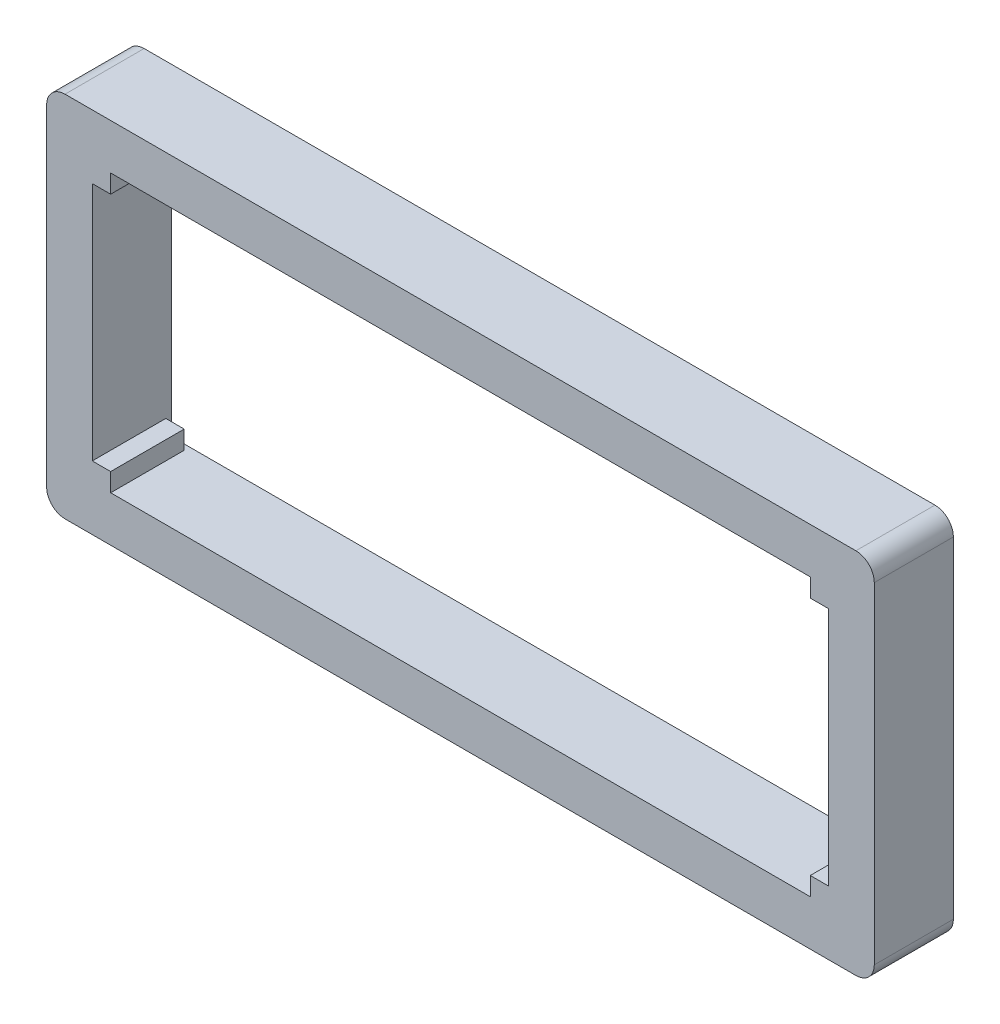
ISO-10303-21;
HEADER;
FILE_DESCRIPTION(('STEP AP214'),'2;1');
FILE_NAME('part.step','',(''),(''),'','','');
FILE_SCHEMA(('AUTOMOTIVE_DESIGN { 1 0 10303 214 1 1 1 1 }'));
ENDSEC;
DATA;
#1=APPLICATION_CONTEXT('core data for automotive mechanical design processes');
#2=APPLICATION_PROTOCOL_DEFINITION('international standard','automotive_design',2000,#1);
#3=PRODUCT_CONTEXT('',#1,'mechanical');
#4=PRODUCT('Part','Part','',(#3));
#5=PRODUCT_RELATED_PRODUCT_CATEGORY('part','',(#4));
#6=PRODUCT_DEFINITION_FORMATION('','',#4);
#7=PRODUCT_DEFINITION_CONTEXT('part definition',#1,'design');
#8=PRODUCT_DEFINITION('design','',#6,#7);
#9=PRODUCT_DEFINITION_SHAPE('','',#8);
#10=(LENGTH_UNIT() NAMED_UNIT(*) SI_UNIT(.MILLI.,.METRE.));
#11=(NAMED_UNIT(*) PLANE_ANGLE_UNIT() SI_UNIT($,.RADIAN.));
#12=(NAMED_UNIT(*) SI_UNIT($,.STERADIAN.) SOLID_ANGLE_UNIT());
#13=UNCERTAINTY_MEASURE_WITH_UNIT(LENGTH_MEASURE(1.E-05),#10,'distance_accuracy_value','');
#14=(GEOMETRIC_REPRESENTATION_CONTEXT(3) GLOBAL_UNCERTAINTY_ASSIGNED_CONTEXT((#13)) GLOBAL_UNIT_ASSIGNED_CONTEXT((#10,
#11,#12)) REPRESENTATION_CONTEXT('',''));
#15=CARTESIAN_POINT('',(0.,0.,0.));
#16=DIRECTION('',(0.,0.,1.));
#17=DIRECTION('',(1.,0.,0.));
#18=AXIS2_PLACEMENT_3D('',#15,#16,#17);
#19=CARTESIAN_POINT('',(0.,0.,0.));
#20=DIRECTION('',(0.,0.,1.));
#21=DIRECTION('',(1.,0.,0.));
#22=AXIS2_PLACEMENT_3D('',#19,#20,#21);
#23=PLANE('',#22);
#24=DIRECTION('',(1.,0.,0.));
#25=VECTOR('',#24,1.);
#26=CARTESIAN_POINT('',(-12.4,-12.35,0.));
#27=LINE('',#26,#25);
#28=CARTESIAN_POINT('',(-7.40000000000004,-12.35,0.));
#29=VERTEX_POINT('',#28);
#30=CARTESIAN_POINT('',(207.6,-12.35,0.));
#31=VERTEX_POINT('',#30);
#32=EDGE_CURVE('E360',#29,#31,#27,.T.);
#33=ORIENTED_EDGE('',*,*,#32,.F.);
#34=CARTESIAN_POINT('',(-7.40000000000004,-7.35000000000001,0.));
#35=DIRECTION('',(0.,0.,1.));
#36=DIRECTION('',(1.,0.,0.));
#37=AXIS2_PLACEMENT_3D('',#34,#35,#36);
#38=CIRCLE('',#37,5.);
#39=CARTESIAN_POINT('',(-12.4,-7.35000000000001,0.));
#40=VERTEX_POINT('',#39);
#41=EDGE_CURVE('E376',#29,#40,#38,.F.);
#42=ORIENTED_EDGE('',*,*,#41,.T.);
#43=DIRECTION('',(0.,-1.,0.));
#44=VECTOR('',#43,1.);
#45=CARTESIAN_POINT('',(-12.4,87.65,0.));
#46=LINE('',#45,#44);
#47=CARTESIAN_POINT('',(-12.4,82.65,0.));
#48=VERTEX_POINT('',#47);
#49=EDGE_CURVE('E353',#48,#40,#46,.T.);
#50=ORIENTED_EDGE('',*,*,#49,.F.);
#51=CARTESIAN_POINT('',(-7.40000000000004,82.65,0.));
#52=DIRECTION('',(0.,0.,1.));
#53=DIRECTION('',(1.,0.,0.));
#54=AXIS2_PLACEMENT_3D('',#51,#52,#53);
#55=CIRCLE('',#54,5.);
#56=CARTESIAN_POINT('',(-7.40000000000004,87.65,0.));
#57=VERTEX_POINT('',#56);
#58=EDGE_CURVE('E367',#48,#57,#55,.F.);
#59=ORIENTED_EDGE('',*,*,#58,.T.);
#60=DIRECTION('',(-1.,0.,0.));
#61=VECTOR('',#60,1.);
#62=CARTESIAN_POINT('',(-12.4,87.65,0.));
#63=LINE('',#62,#61);
#64=CARTESIAN_POINT('',(207.6,87.65,0.));
#65=VERTEX_POINT('',#64);
#66=EDGE_CURVE('E362',#65,#57,#63,.T.);
#67=ORIENTED_EDGE('',*,*,#66,.F.);
#68=CARTESIAN_POINT('',(207.6,82.65,0.));
#69=DIRECTION('',(0.,0.,1.));
#70=DIRECTION('',(1.,0.,0.));
#71=AXIS2_PLACEMENT_3D('',#68,#69,#70);
#72=CIRCLE('',#71,5.);
#73=CARTESIAN_POINT('',(212.6,82.65,0.));
#74=VERTEX_POINT('',#73);
#75=EDGE_CURVE('E375',#65,#74,#72,.F.);
#76=ORIENTED_EDGE('',*,*,#75,.T.);
#77=DIRECTION('',(0.,1.,0.));
#78=VECTOR('',#77,1.);
#79=CARTESIAN_POINT('',(212.6,87.65,0.));
#80=LINE('',#79,#78);
#81=CARTESIAN_POINT('',(212.6,-7.35000000000004,0.));
#82=VERTEX_POINT('',#81);
#83=EDGE_CURVE('E357',#82,#74,#80,.T.);
#84=ORIENTED_EDGE('',*,*,#83,.F.);
#85=CARTESIAN_POINT('',(207.6,-7.35000000000004,0.));
#86=DIRECTION('',(0.,0.,1.));
#87=DIRECTION('',(1.,0.,0.));
#88=AXIS2_PLACEMENT_3D('',#85,#86,#87);
#89=CIRCLE('',#88,5.);
#90=EDGE_CURVE('E372',#82,#31,#89,.F.);
#91=ORIENTED_EDGE('',*,*,#90,.T.);
#92=EDGE_LOOP('',(#33,#42,#50,#59,#67,#76,#84,#91));
#93=FACE_BOUND('',#92,.T.);
#94=DIRECTION('',(0.,-1.,0.));
#95=VECTOR('',#94,1.);
#96=CARTESIAN_POINT('',(0.,0.,0.));
#97=LINE('',#96,#95);
#98=CARTESIAN_POINT('',(0.,75.3,0.));
#99=VERTEX_POINT('',#98);
#100=CARTESIAN_POINT('',(0.,0.,0.));
#101=VERTEX_POINT('',#100);
#102=EDGE_CURVE('E291',#99,#101,#97,.T.);
#103=ORIENTED_EDGE('',*,*,#102,.T.);
#104=DIRECTION('',(1.,0.,0.));
#105=VECTOR('',#104,1.);
#106=CARTESIAN_POINT('',(0.,0.,0.));
#107=LINE('',#106,#105);
#108=CARTESIAN_POINT('',(200.2,0.,0.));
#109=VERTEX_POINT('',#108);
#110=EDGE_CURVE('E339',#101,#109,#107,.T.);
#111=ORIENTED_EDGE('',*,*,#110,.T.);
#112=DIRECTION('',(0.,1.,0.));
#113=VECTOR('',#112,1.);
#114=CARTESIAN_POINT('',(200.2,0.,0.));
#115=LINE('',#114,#113);
#116=CARTESIAN_POINT('',(200.2,75.3,0.));
#117=VERTEX_POINT('',#116);
#118=EDGE_CURVE('E338',#109,#117,#115,.T.);
#119=ORIENTED_EDGE('',*,*,#118,.T.);
#120=DIRECTION('',(-1.,0.,0.));
#121=VECTOR('',#120,1.);
#122=CARTESIAN_POINT('',(0.,75.3,0.));
#123=LINE('',#122,#121);
#124=EDGE_CURVE('E345',#117,#99,#123,.T.);
#125=ORIENTED_EDGE('',*,*,#124,.T.);
#126=EDGE_LOOP('',(#103,#111,#119,#125));
#127=FACE_BOUND('',#126,.T.);
#128=ADVANCED_FACE('F90',(#93,#127),#23,.F.);
#129=CARTESIAN_POINT('',(-12.4,87.65,1.5));
#130=DIRECTION('',(1.,0.,0.));
#131=DIRECTION('',(0.,0.,-1.));
#132=AXIS2_PLACEMENT_3D('',#129,#130,#131);
#133=PLANE('',#132);
#134=ORIENTED_EDGE('',*,*,#49,.T.);
#135=DIRECTION('',(0.,0.,-1.));
#136=VECTOR('',#135,1.);
#137=CARTESIAN_POINT('',(-12.4,-7.35000000000001,1.5));
#138=LINE('',#137,#136);
#139=CARTESIAN_POINT('',(-12.4,-7.35000000000001,21.5));
#140=VERTEX_POINT('',#139);
#141=EDGE_CURVE('E381',#40,#140,#138,.F.);
#142=ORIENTED_EDGE('',*,*,#141,.T.);
#143=DIRECTION('',(0.,-1.,0.));
#144=VECTOR('',#143,1.);
#145=CARTESIAN_POINT('',(-12.4,0.,21.5));
#146=LINE('',#145,#144);
#147=CARTESIAN_POINT('',(-12.4,82.65,21.5));
#148=VERTEX_POINT('',#147);
#149=EDGE_CURVE('E409',#148,#140,#146,.T.);
#150=ORIENTED_EDGE('',*,*,#149,.F.);
#151=DIRECTION('',(0.,0.,-1.));
#152=VECTOR('',#151,1.);
#153=CARTESIAN_POINT('',(-12.4,82.65,1.5));
#154=LINE('',#153,#152);
#155=EDGE_CURVE('E378',#148,#48,#154,.T.);
#156=ORIENTED_EDGE('',*,*,#155,.T.);
#157=EDGE_LOOP('',(#134,#142,#150,#156));
#158=FACE_BOUND('',#157,.T.);
#159=ADVANCED_FACE('F415',(#158),#133,.F.);
#160=CARTESIAN_POINT('',(-12.4,-12.35,1.5));
#161=DIRECTION('',(0.,1.,0.));
#162=DIRECTION('',(-1.,0.,0.));
#163=AXIS2_PLACEMENT_3D('',#160,#161,#162);
#164=PLANE('',#163);
#165=DIRECTION('',(1.,0.,0.));
#166=VECTOR('',#165,1.);
#167=CARTESIAN_POINT('',(0.,-12.35,21.5));
#168=LINE('',#167,#166);
#169=CARTESIAN_POINT('',(-7.40000000000004,-12.35,21.5));
#170=VERTEX_POINT('',#169);
#171=CARTESIAN_POINT('',(207.6,-12.35,21.5));
#172=VERTEX_POINT('',#171);
#173=EDGE_CURVE('E422',#170,#172,#168,.T.);
#174=ORIENTED_EDGE('',*,*,#173,.F.);
#175=DIRECTION('',(0.,0.,-1.));
#176=VECTOR('',#175,1.);
#177=CARTESIAN_POINT('',(-7.40000000000004,-12.35,1.5));
#178=LINE('',#177,#176);
#179=EDGE_CURVE('E370',#170,#29,#178,.T.);
#180=ORIENTED_EDGE('',*,*,#179,.T.);
#181=ORIENTED_EDGE('',*,*,#32,.T.);
#182=DIRECTION('',(0.,0.,-1.));
#183=VECTOR('',#182,1.);
#184=CARTESIAN_POINT('',(207.6,-12.35,1.5));
#185=LINE('',#184,#183);
#186=EDGE_CURVE('E364',#31,#172,#185,.F.);
#187=ORIENTED_EDGE('',*,*,#186,.T.);
#188=EDGE_LOOP('',(#174,#180,#181,#187));
#189=FACE_BOUND('',#188,.T.);
#190=ADVANCED_FACE('F421',(#189),#164,.F.);
#191=CARTESIAN_POINT('',(212.6,87.65,1.5));
#192=DIRECTION('',(-1.,0.,0.));
#193=DIRECTION('',(0.,0.,1.));
#194=AXIS2_PLACEMENT_3D('',#191,#192,#193);
#195=PLANE('',#194);
#196=DIRECTION('',(0.,1.,0.));
#197=VECTOR('',#196,1.);
#198=CARTESIAN_POINT('',(212.6,0.,21.5));
#199=LINE('',#198,#197);
#200=CARTESIAN_POINT('',(212.6,-7.35000000000004,21.5));
#201=VERTEX_POINT('',#200);
#202=CARTESIAN_POINT('',(212.6,82.65,21.5));
#203=VERTEX_POINT('',#202);
#204=EDGE_CURVE('E426',#201,#203,#199,.T.);
#205=ORIENTED_EDGE('',*,*,#204,.F.);
#206=DIRECTION('',(0.,0.,-1.));
#207=VECTOR('',#206,1.);
#208=CARTESIAN_POINT('',(212.6,-7.35000000000004,1.5));
#209=LINE('',#208,#207);
#210=EDGE_CURVE('E394',#201,#82,#209,.T.);
#211=ORIENTED_EDGE('',*,*,#210,.T.);
#212=ORIENTED_EDGE('',*,*,#83,.T.);
#213=DIRECTION('',(0.,0.,-1.));
#214=VECTOR('',#213,1.);
#215=CARTESIAN_POINT('',(212.6,82.65,1.5));
#216=LINE('',#215,#214);
#217=EDGE_CURVE('E102',#74,#203,#216,.F.);
#218=ORIENTED_EDGE('',*,*,#217,.T.);
#219=EDGE_LOOP('',(#205,#211,#212,#218));
#220=FACE_BOUND('',#219,.T.);
#221=ADVANCED_FACE('F492',(#220),#195,.F.);
#222=CARTESIAN_POINT('',(-12.4,87.65,1.5));
#223=DIRECTION('',(0.,-1.,0.));
#224=DIRECTION('',(1.,0.,0.));
#225=AXIS2_PLACEMENT_3D('',#222,#223,#224);
#226=PLANE('',#225);
#227=DIRECTION('',(-1.,0.,0.));
#228=VECTOR('',#227,1.);
#229=CARTESIAN_POINT('',(0.,87.65,21.5));
#230=LINE('',#229,#228);
#231=CARTESIAN_POINT('',(207.6,87.65,21.5));
#232=VERTEX_POINT('',#231);
#233=CARTESIAN_POINT('',(-7.40000000000004,87.65,21.5));
#234=VERTEX_POINT('',#233);
#235=EDGE_CURVE('E396',#232,#234,#230,.T.);
#236=ORIENTED_EDGE('',*,*,#235,.F.);
#237=DIRECTION('',(0.,0.,-1.));
#238=VECTOR('',#237,1.);
#239=CARTESIAN_POINT('',(207.6,87.65,1.5));
#240=LINE('',#239,#238);
#241=EDGE_CURVE('E12',#232,#65,#240,.T.);
#242=ORIENTED_EDGE('',*,*,#241,.T.);
#243=ORIENTED_EDGE('',*,*,#66,.T.);
#244=DIRECTION('',(0.,0.,-1.));
#245=VECTOR('',#244,1.);
#246=CARTESIAN_POINT('',(-7.40000000000004,87.65,1.5));
#247=LINE('',#246,#245);
#248=EDGE_CURVE('E100',#57,#234,#247,.F.);
#249=ORIENTED_EDGE('',*,*,#248,.T.);
#250=EDGE_LOOP('',(#236,#242,#243,#249));
#251=FACE_BOUND('',#250,.T.);
#252=ADVANCED_FACE('F400',(#251),#226,.F.);
#253=CARTESIAN_POINT('',(0.,0.,1.5));
#254=DIRECTION('',(1.,0.,0.));
#255=DIRECTION('',(0.,0.,-1.));
#256=AXIS2_PLACEMENT_3D('',#253,#254,#255);
#257=PLANE('',#256);
#258=ORIENTED_EDGE('',*,*,#102,.F.);
#259=DIRECTION('',(0.,0.,-1.));
#260=VECTOR('',#259,1.);
#261=CARTESIAN_POINT('',(0.,75.3,1.5));
#262=LINE('',#261,#260);
#263=CARTESIAN_POINT('',(0.,75.3,1.5));
#264=VERTEX_POINT('',#263);
#265=EDGE_CURVE('E334',#264,#99,#262,.T.);
#266=ORIENTED_EDGE('',*,*,#265,.F.);
#267=DIRECTION('',(0.,-1.,0.));
#268=VECTOR('',#267,1.);
#269=CARTESIAN_POINT('',(0.,0.,1.5));
#270=LINE('',#269,#268);
#271=CARTESIAN_POINT('',(0.,70.3,1.5));
#272=VERTEX_POINT('',#271);
#273=EDGE_CURVE('E317',#264,#272,#270,.T.);
#274=ORIENTED_EDGE('',*,*,#273,.T.);
#275=DIRECTION('',(0.,0.,-1.));
#276=VECTOR('',#275,1.);
#277=CARTESIAN_POINT('',(0.,70.3,21.5));
#278=LINE('',#277,#276);
#279=CARTESIAN_POINT('',(0.,70.3,21.5));
#280=VERTEX_POINT('',#279);
#281=EDGE_CURVE('E281',#280,#272,#278,.T.);
#282=ORIENTED_EDGE('',*,*,#281,.F.);
#283=DIRECTION('',(0.,1.,0.));
#284=VECTOR('',#283,1.);
#285=CARTESIAN_POINT('',(0.,0.,21.5));
#286=LINE('',#285,#284);
#287=CARTESIAN_POINT('',(0.,4.99999999999998,21.5));
#288=VERTEX_POINT('',#287);
#289=EDGE_CURVE('E406',#288,#280,#286,.T.);
#290=ORIENTED_EDGE('',*,*,#289,.F.);
#291=DIRECTION('',(0.,0.,-1.));
#292=VECTOR('',#291,1.);
#293=CARTESIAN_POINT('',(0.,4.99999999999998,21.5));
#294=LINE('',#293,#292);
#295=CARTESIAN_POINT('',(0.,4.99999999999998,1.5));
#296=VERTEX_POINT('',#295);
#297=EDGE_CURVE('E276',#288,#296,#294,.T.);
#298=ORIENTED_EDGE('',*,*,#297,.T.);
#299=CARTESIAN_POINT('',(0.,0.,1.5));
#300=VERTEX_POINT('',#299);
#301=EDGE_CURVE('E323',#296,#300,#270,.T.);
#302=ORIENTED_EDGE('',*,*,#301,.T.);
#303=DIRECTION('',(0.,0.,-1.));
#304=VECTOR('',#303,1.);
#305=CARTESIAN_POINT('',(0.,0.,1.5));
#306=LINE('',#305,#304);
#307=EDGE_CURVE('E354',#300,#101,#306,.T.);
#308=ORIENTED_EDGE('',*,*,#307,.T.);
#309=EDGE_LOOP('',(#258,#266,#274,#282,#290,#298,#302,#308));
#310=FACE_BOUND('',#309,.T.);
#311=ADVANCED_FACE('F487',(#310),#257,.T.);
#312=CARTESIAN_POINT('',(0.,0.,1.5));
#313=DIRECTION('',(0.,1.,0.));
#314=DIRECTION('',(0.,0.,1.));
#315=AXIS2_PLACEMENT_3D('',#312,#313,#314);
#316=PLANE('',#315);
#317=ORIENTED_EDGE('',*,*,#110,.F.);
#318=ORIENTED_EDGE('',*,*,#307,.F.);
#319=DIRECTION('',(1.,0.,0.));
#320=VECTOR('',#319,1.);
#321=CARTESIAN_POINT('',(0.,0.,1.5));
#322=LINE('',#321,#320);
#323=CARTESIAN_POINT('',(5.00000000000001,0.,1.5));
#324=VERTEX_POINT('',#323);
#325=EDGE_CURVE('E322',#300,#324,#322,.T.);
#326=ORIENTED_EDGE('',*,*,#325,.T.);
#327=DIRECTION('',(0.,0.,-1.));
#328=VECTOR('',#327,1.);
#329=CARTESIAN_POINT('',(5.00000000000001,0.,21.5));
#330=LINE('',#329,#328);
#331=CARTESIAN_POINT('',(5.00000000000001,0.,21.5));
#332=VERTEX_POINT('',#331);
#333=EDGE_CURVE('E289',#332,#324,#330,.T.);
#334=ORIENTED_EDGE('',*,*,#333,.F.);
#335=DIRECTION('',(-1.,0.,0.));
#336=VECTOR('',#335,1.);
#337=CARTESIAN_POINT('',(0.,0.,21.5));
#338=LINE('',#337,#336);
#339=CARTESIAN_POINT('',(195.2,0.,21.5));
#340=VERTEX_POINT('',#339);
#341=EDGE_CURVE('E809',#340,#332,#338,.T.);
#342=ORIENTED_EDGE('',*,*,#341,.F.);
#343=DIRECTION('',(0.,0.,-1.));
#344=VECTOR('',#343,1.);
#345=CARTESIAN_POINT('',(195.2,0.,21.5));
#346=LINE('',#345,#344);
#347=CARTESIAN_POINT('',(195.2,0.,1.5));
#348=VERTEX_POINT('',#347);
#349=EDGE_CURVE('E428',#340,#348,#346,.T.);
#350=ORIENTED_EDGE('',*,*,#349,.T.);
#351=CARTESIAN_POINT('',(200.2,0.,1.5));
#352=VERTEX_POINT('',#351);
#353=EDGE_CURVE('E325',#348,#352,#322,.T.);
#354=ORIENTED_EDGE('',*,*,#353,.T.);
#355=DIRECTION('',(0.,0.,-1.));
#356=VECTOR('',#355,1.);
#357=CARTESIAN_POINT('',(200.2,0.,1.5));
#358=LINE('',#357,#356);
#359=EDGE_CURVE('E349',#352,#109,#358,.T.);
#360=ORIENTED_EDGE('',*,*,#359,.T.);
#361=EDGE_LOOP('',(#317,#318,#326,#334,#342,#350,#354,#360));
#362=FACE_BOUND('',#361,.T.);
#363=ADVANCED_FACE('F631',(#362),#316,.T.);
#364=CARTESIAN_POINT('',(200.2,0.,1.5));
#365=DIRECTION('',(-1.,0.,0.));
#366=DIRECTION('',(0.,0.,1.));
#367=AXIS2_PLACEMENT_3D('',#364,#365,#366);
#368=PLANE('',#367);
#369=ORIENTED_EDGE('',*,*,#118,.F.);
#370=ORIENTED_EDGE('',*,*,#359,.F.);
#371=DIRECTION('',(0.,1.,0.));
#372=VECTOR('',#371,1.);
#373=CARTESIAN_POINT('',(200.2,0.,1.5));
#374=LINE('',#373,#372);
#375=CARTESIAN_POINT('',(200.2,5.,1.5));
#376=VERTEX_POINT('',#375);
#377=EDGE_CURVE('E327',#352,#376,#374,.T.);
#378=ORIENTED_EDGE('',*,*,#377,.T.);
#379=DIRECTION('',(0.,0.,-1.));
#380=VECTOR('',#379,1.);
#381=CARTESIAN_POINT('',(200.2,5.,21.5));
#382=LINE('',#381,#380);
#383=CARTESIAN_POINT('',(200.2,5.,21.5));
#384=VERTEX_POINT('',#383);
#385=EDGE_CURVE('E443',#384,#376,#382,.T.);
#386=ORIENTED_EDGE('',*,*,#385,.F.);
#387=DIRECTION('',(0.,-1.,0.));
#388=VECTOR('',#387,1.);
#389=CARTESIAN_POINT('',(200.2,0.,21.5));
#390=LINE('',#389,#388);
#391=CARTESIAN_POINT('',(200.2,70.3,21.5));
#392=VERTEX_POINT('',#391);
#393=EDGE_CURVE('E454',#392,#384,#390,.T.);
#394=ORIENTED_EDGE('',*,*,#393,.F.);
#395=DIRECTION('',(0.,0.,-1.));
#396=VECTOR('',#395,1.);
#397=CARTESIAN_POINT('',(200.2,70.3,21.5));
#398=LINE('',#397,#396);
#399=CARTESIAN_POINT('',(200.2,70.3,1.5));
#400=VERTEX_POINT('',#399);
#401=EDGE_CURVE('E283',#392,#400,#398,.T.);
#402=ORIENTED_EDGE('',*,*,#401,.T.);
#403=CARTESIAN_POINT('',(200.2,75.3,1.5));
#404=VERTEX_POINT('',#403);
#405=EDGE_CURVE('E330',#400,#404,#374,.T.);
#406=ORIENTED_EDGE('',*,*,#405,.T.);
#407=DIRECTION('',(0.,0.,-1.));
#408=VECTOR('',#407,1.);
#409=CARTESIAN_POINT('',(200.2,75.3,1.5));
#410=LINE('',#409,#408);
#411=EDGE_CURVE('E350',#404,#117,#410,.T.);
#412=ORIENTED_EDGE('',*,*,#411,.T.);
#413=EDGE_LOOP('',(#369,#370,#378,#386,#394,#402,#406,#412));
#414=FACE_BOUND('',#413,.T.);
#415=ADVANCED_FACE('F455',(#414),#368,.T.);
#416=CARTESIAN_POINT('',(0.,75.3,1.5));
#417=DIRECTION('',(0.,-1.,0.));
#418=DIRECTION('',(0.,0.,-1.));
#419=AXIS2_PLACEMENT_3D('',#416,#417,#418);
#420=PLANE('',#419);
#421=ORIENTED_EDGE('',*,*,#124,.F.);
#422=ORIENTED_EDGE('',*,*,#411,.F.);
#423=DIRECTION('',(-1.,0.,0.));
#424=VECTOR('',#423,1.);
#425=CARTESIAN_POINT('',(0.,75.3,1.5));
#426=LINE('',#425,#424);
#427=CARTESIAN_POINT('',(195.2,75.3,1.5));
#428=VERTEX_POINT('',#427);
#429=EDGE_CURVE('E279',#404,#428,#426,.T.);
#430=ORIENTED_EDGE('',*,*,#429,.T.);
#431=DIRECTION('',(0.,0.,-1.));
#432=VECTOR('',#431,1.);
#433=CARTESIAN_POINT('',(195.2,75.3,21.5));
#434=LINE('',#433,#432);
#435=CARTESIAN_POINT('',(195.2,75.3,21.5));
#436=VERTEX_POINT('',#435);
#437=EDGE_CURVE('E267',#436,#428,#434,.T.);
#438=ORIENTED_EDGE('',*,*,#437,.F.);
#439=DIRECTION('',(1.,0.,0.));
#440=VECTOR('',#439,1.);
#441=CARTESIAN_POINT('',(0.,75.3,21.5));
#442=LINE('',#441,#440);
#443=CARTESIAN_POINT('',(5.,75.3,21.5));
#444=VERTEX_POINT('',#443);
#445=EDGE_CURVE('E252',#444,#436,#442,.T.);
#446=ORIENTED_EDGE('',*,*,#445,.F.);
#447=DIRECTION('',(0.,0.,-1.));
#448=VECTOR('',#447,1.);
#449=CARTESIAN_POINT('',(5.,75.3,21.5));
#450=LINE('',#449,#448);
#451=CARTESIAN_POINT('',(5.,75.3,1.5));
#452=VERTEX_POINT('',#451);
#453=EDGE_CURVE('E292',#444,#452,#450,.T.);
#454=ORIENTED_EDGE('',*,*,#453,.T.);
#455=EDGE_CURVE('E332',#452,#264,#426,.T.);
#456=ORIENTED_EDGE('',*,*,#455,.T.);
#457=ORIENTED_EDGE('',*,*,#265,.T.);
#458=EDGE_LOOP('',(#421,#422,#430,#438,#446,#454,#456,#457));
#459=FACE_BOUND('',#458,.T.);
#460=ADVANCED_FACE('F277',(#459),#420,.T.);
#461=CARTESIAN_POINT('',(0.,0.,1.5));
#462=DIRECTION('',(0.,0.,1.));
#463=DIRECTION('',(1.,0.,0.));
#464=AXIS2_PLACEMENT_3D('',#461,#462,#463);
#465=PLANE('',#464);
#466=ORIENTED_EDGE('',*,*,#325,.F.);
#467=ORIENTED_EDGE('',*,*,#301,.F.);
#468=DIRECTION('',(1.,0.,0.));
#469=VECTOR('',#468,1.);
#470=CARTESIAN_POINT('',(0.,4.99999999999998,1.5));
#471=LINE('',#470,#469);
#472=CARTESIAN_POINT('',(5.00000000000001,4.99999999999998,1.5));
#473=VERTEX_POINT('',#472);
#474=EDGE_CURVE('E311',#296,#473,#471,.T.);
#475=ORIENTED_EDGE('',*,*,#474,.T.);
#476=DIRECTION('',(0.,1.,0.));
#477=VECTOR('',#476,1.);
#478=CARTESIAN_POINT('',(5.00000000000001,0.,1.5));
#479=LINE('',#478,#477);
#480=EDGE_CURVE('E313',#324,#473,#479,.T.);
#481=ORIENTED_EDGE('',*,*,#480,.F.);
#482=EDGE_LOOP('',(#466,#467,#475,#481));
#483=FACE_BOUND('',#482,.T.);
#484=ADVANCED_FACE('F461',(#483),#465,.F.);
#485=ORIENTED_EDGE('',*,*,#273,.F.);
#486=ORIENTED_EDGE('',*,*,#455,.F.);
#487=DIRECTION('',(0.,-1.,0.));
#488=VECTOR('',#487,1.);
#489=CARTESIAN_POINT('',(5.,75.3,1.5));
#490=LINE('',#489,#488);
#491=CARTESIAN_POINT('',(5.,70.3,1.5));
#492=VERTEX_POINT('',#491);
#493=EDGE_CURVE('E298',#452,#492,#490,.T.);
#494=ORIENTED_EDGE('',*,*,#493,.T.);
#495=DIRECTION('',(1.,0.,0.));
#496=VECTOR('',#495,1.);
#497=CARTESIAN_POINT('',(0.,70.3,1.5));
#498=LINE('',#497,#496);
#499=EDGE_CURVE('E299',#272,#492,#498,.T.);
#500=ORIENTED_EDGE('',*,*,#499,.F.);
#501=EDGE_LOOP('',(#485,#486,#494,#500));
#502=FACE_BOUND('',#501,.T.);
#503=ADVANCED_FACE('F478',(#502),#465,.F.);
#504=ORIENTED_EDGE('',*,*,#353,.F.);
#505=DIRECTION('',(0.,1.,0.));
#506=VECTOR('',#505,1.);
#507=CARTESIAN_POINT('',(195.2,0.,1.5));
#508=LINE('',#507,#506);
#509=CARTESIAN_POINT('',(195.2,5.00000000000001,1.5));
#510=VERTEX_POINT('',#509);
#511=EDGE_CURVE('E263',#348,#510,#508,.T.);
#512=ORIENTED_EDGE('',*,*,#511,.T.);
#513=DIRECTION('',(-1.,0.,0.));
#514=VECTOR('',#513,1.);
#515=CARTESIAN_POINT('',(0.,5.00000000000007,1.5));
#516=LINE('',#515,#514);
#517=EDGE_CURVE('E436',#376,#510,#516,.T.);
#518=ORIENTED_EDGE('',*,*,#517,.F.);
#519=ORIENTED_EDGE('',*,*,#377,.F.);
#520=EDGE_LOOP('',(#504,#512,#518,#519));
#521=FACE_BOUND('',#520,.T.);
#522=ADVANCED_FACE('F465',(#521),#465,.F.);
#523=CARTESIAN_POINT('',(195.2,0.,21.5));
#524=DIRECTION('',(1.,0.,0.));
#525=DIRECTION('',(0.,0.,-1.));
#526=AXIS2_PLACEMENT_3D('',#523,#524,#525);
#527=PLANE('',#526);
#528=DIRECTION('',(0.,-1.,0.));
#529=VECTOR('',#528,1.);
#530=CARTESIAN_POINT('',(195.2,0.,1.5));
#531=LINE('',#530,#529);
#532=CARTESIAN_POINT('',(195.2,70.3,1.5));
#533=VERTEX_POINT('',#532);
#534=EDGE_CURVE('E308',#428,#533,#531,.T.);
#535=ORIENTED_EDGE('',*,*,#534,.T.);
#536=DIRECTION('',(0.,0.,-1.));
#537=VECTOR('',#536,1.);
#538=CARTESIAN_POINT('',(195.2,70.3,21.5));
#539=LINE('',#538,#537);
#540=CARTESIAN_POINT('',(195.2,70.3,21.5));
#541=VERTEX_POINT('',#540);
#542=EDGE_CURVE('E271',#541,#533,#539,.T.);
#543=ORIENTED_EDGE('',*,*,#542,.F.);
#544=DIRECTION('',(0.,-1.,0.));
#545=VECTOR('',#544,1.);
#546=CARTESIAN_POINT('',(195.2,0.,21.5));
#547=LINE('',#546,#545);
#548=EDGE_CURVE('E258',#436,#541,#547,.T.);
#549=ORIENTED_EDGE('',*,*,#548,.F.);
#550=ORIENTED_EDGE('',*,*,#437,.T.);
#551=EDGE_LOOP('',(#535,#543,#549,#550));
#552=FACE_BOUND('',#551,.T.);
#553=ADVANCED_FACE('F268',(#552),#527,.F.);
#554=CARTESIAN_POINT('',(0.,70.3,21.5));
#555=DIRECTION('',(0.,-1.,0.));
#556=DIRECTION('',(0.,0.,-1.));
#557=AXIS2_PLACEMENT_3D('',#554,#555,#556);
#558=PLANE('',#557);
#559=DIRECTION('',(-1.,0.,0.));
#560=VECTOR('',#559,1.);
#561=CARTESIAN_POINT('',(0.,70.3,1.5));
#562=LINE('',#561,#560);
#563=EDGE_CURVE('E433',#400,#533,#562,.T.);
#564=ORIENTED_EDGE('',*,*,#563,.F.);
#565=ORIENTED_EDGE('',*,*,#401,.F.);
#566=DIRECTION('',(-1.,0.,0.));
#567=VECTOR('',#566,1.);
#568=CARTESIAN_POINT('',(0.,70.3,21.5));
#569=LINE('',#568,#567);
#570=EDGE_CURVE('E272',#392,#541,#569,.T.);
#571=ORIENTED_EDGE('',*,*,#570,.T.);
#572=ORIENTED_EDGE('',*,*,#542,.T.);
#573=EDGE_LOOP('',(#564,#565,#571,#572));
#574=FACE_BOUND('',#573,.T.);
#575=ADVANCED_FACE('F457',(#574),#558,.T.);
#576=CARTESIAN_POINT('',(0.,5.00000000000007,21.5));
#577=DIRECTION('',(0.,-1.,0.));
#578=DIRECTION('',(1.,0.,0.));
#579=AXIS2_PLACEMENT_3D('',#576,#577,#578);
#580=PLANE('',#579);
#581=ORIENTED_EDGE('',*,*,#517,.T.);
#582=DIRECTION('',(0.,0.,-1.));
#583=VECTOR('',#582,1.);
#584=CARTESIAN_POINT('',(195.2,5.00000000000001,21.5));
#585=LINE('',#584,#583);
#586=CARTESIAN_POINT('',(195.2,5.00000000000001,21.5));
#587=VERTEX_POINT('',#586);
#588=EDGE_CURVE('E444',#587,#510,#585,.T.);
#589=ORIENTED_EDGE('',*,*,#588,.F.);
#590=DIRECTION('',(-1.,0.,0.));
#591=VECTOR('',#590,1.);
#592=CARTESIAN_POINT('',(0.,5.00000000000007,21.5));
#593=LINE('',#592,#591);
#594=EDGE_CURVE('E807',#384,#587,#593,.T.);
#595=ORIENTED_EDGE('',*,*,#594,.F.);
#596=ORIENTED_EDGE('',*,*,#385,.T.);
#597=EDGE_LOOP('',(#581,#589,#595,#596));
#598=FACE_BOUND('',#597,.T.);
#599=ADVANCED_FACE('F472',(#598),#580,.F.);
#600=CARTESIAN_POINT('',(195.2,0.,21.5));
#601=DIRECTION('',(-1.,0.,0.));
#602=DIRECTION('',(0.,0.,1.));
#603=AXIS2_PLACEMENT_3D('',#600,#601,#602);
#604=PLANE('',#603);
#605=ORIENTED_EDGE('',*,*,#511,.F.);
#606=ORIENTED_EDGE('',*,*,#349,.F.);
#607=DIRECTION('',(0.,1.,0.));
#608=VECTOR('',#607,1.);
#609=CARTESIAN_POINT('',(195.2,0.,21.5));
#610=LINE('',#609,#608);
#611=EDGE_CURVE('E810',#340,#587,#610,.T.);
#612=ORIENTED_EDGE('',*,*,#611,.T.);
#613=ORIENTED_EDGE('',*,*,#588,.T.);
#614=EDGE_LOOP('',(#605,#606,#612,#613));
#615=FACE_BOUND('',#614,.T.);
#616=ADVANCED_FACE('F458',(#615),#604,.T.);
#617=ORIENTED_EDGE('',*,*,#429,.F.);
#618=ORIENTED_EDGE('',*,*,#405,.F.);
#619=ORIENTED_EDGE('',*,*,#563,.T.);
#620=ORIENTED_EDGE('',*,*,#534,.F.);
#621=EDGE_LOOP('',(#617,#618,#619,#620));
#622=FACE_BOUND('',#621,.T.);
#623=ADVANCED_FACE('F456',(#622),#465,.F.);
#624=CARTESIAN_POINT('',(0.,0.,21.5));
#625=DIRECTION('',(0.,0.,1.));
#626=DIRECTION('',(1.,0.,0.));
#627=AXIS2_PLACEMENT_3D('',#624,#625,#626);
#628=PLANE('',#627);
#629=DIRECTION('',(0.,-1.,0.));
#630=VECTOR('',#629,1.);
#631=CARTESIAN_POINT('',(5.,75.3,21.5));
#632=LINE('',#631,#630);
#633=CARTESIAN_POINT('',(5.,70.3,21.5));
#634=VERTEX_POINT('',#633);
#635=EDGE_CURVE('E259',#444,#634,#632,.T.);
#636=ORIENTED_EDGE('',*,*,#635,.F.);
#637=ORIENTED_EDGE('',*,*,#445,.T.);
#638=ORIENTED_EDGE('',*,*,#548,.T.);
#639=ORIENTED_EDGE('',*,*,#570,.F.);
#640=ORIENTED_EDGE('',*,*,#393,.T.);
#641=ORIENTED_EDGE('',*,*,#594,.T.);
#642=ORIENTED_EDGE('',*,*,#611,.F.);
#643=ORIENTED_EDGE('',*,*,#341,.T.);
#644=DIRECTION('',(0.,1.,0.));
#645=VECTOR('',#644,1.);
#646=CARTESIAN_POINT('',(5.00000000000001,0.,21.5));
#647=LINE('',#646,#645);
#648=CARTESIAN_POINT('',(5.00000000000001,4.99999999999998,21.5));
#649=VERTEX_POINT('',#648);
#650=EDGE_CURVE('E309',#332,#649,#647,.T.);
#651=ORIENTED_EDGE('',*,*,#650,.T.);
#652=DIRECTION('',(1.,0.,0.));
#653=VECTOR('',#652,1.);
#654=CARTESIAN_POINT('',(0.,4.99999999999998,21.5));
#655=LINE('',#654,#653);
#656=EDGE_CURVE('E307',#288,#649,#655,.T.);
#657=ORIENTED_EDGE('',*,*,#656,.F.);
#658=ORIENTED_EDGE('',*,*,#289,.T.);
#659=DIRECTION('',(1.,0.,0.));
#660=VECTOR('',#659,1.);
#661=CARTESIAN_POINT('',(0.,70.3,21.5));
#662=LINE('',#661,#660);
#663=EDGE_CURVE('E293',#280,#634,#662,.T.);
#664=ORIENTED_EDGE('',*,*,#663,.T.);
#665=EDGE_LOOP('',(#636,#637,#638,#639,#640,#641,#642,#643,#651,#657,#658,#664));
#666=FACE_BOUND('',#665,.T.);
#667=ORIENTED_EDGE('',*,*,#149,.T.);
#668=CARTESIAN_POINT('',(-7.40000000000004,-7.35000000000001,21.5));
#669=DIRECTION('',(0.,0.,1.));
#670=DIRECTION('',(1.,0.,0.));
#671=AXIS2_PLACEMENT_3D('',#668,#669,#670);
#672=CIRCLE('',#671,5.);
#673=EDGE_CURVE('E389',#140,#170,#672,.T.);
#674=ORIENTED_EDGE('',*,*,#673,.T.);
#675=ORIENTED_EDGE('',*,*,#173,.T.);
#676=CARTESIAN_POINT('',(207.6,-7.35000000000004,21.5));
#677=DIRECTION('',(0.,0.,1.));
#678=DIRECTION('',(1.,0.,0.));
#679=AXIS2_PLACEMENT_3D('',#676,#677,#678);
#680=CIRCLE('',#679,5.);
#681=EDGE_CURVE('E112',#172,#201,#680,.T.);
#682=ORIENTED_EDGE('',*,*,#681,.T.);
#683=ORIENTED_EDGE('',*,*,#204,.T.);
#684=CARTESIAN_POINT('',(207.6,82.65,21.5));
#685=DIRECTION('',(0.,0.,1.));
#686=DIRECTION('',(1.,0.,0.));
#687=AXIS2_PLACEMENT_3D('',#684,#685,#686);
#688=CIRCLE('',#687,5.);
#689=EDGE_CURVE('E384',#203,#232,#688,.T.);
#690=ORIENTED_EDGE('',*,*,#689,.T.);
#691=ORIENTED_EDGE('',*,*,#235,.T.);
#692=CARTESIAN_POINT('',(-7.40000000000004,82.65,21.5));
#693=DIRECTION('',(0.,0.,1.));
#694=DIRECTION('',(1.,0.,0.));
#695=AXIS2_PLACEMENT_3D('',#692,#693,#694);
#696=CIRCLE('',#695,5.);
#697=EDGE_CURVE('E382',#234,#148,#696,.T.);
#698=ORIENTED_EDGE('',*,*,#697,.T.);
#699=EDGE_LOOP('',(#667,#674,#675,#682,#683,#690,#691,#698));
#700=FACE_BOUND('',#699,.T.);
#701=ADVANCED_FACE('F255',(#666,#700),#628,.T.);
#702=CARTESIAN_POINT('',(5.00000000000001,0.,21.5));
#703=DIRECTION('',(-1.,0.,0.));
#704=DIRECTION('',(0.,-1.,0.));
#705=AXIS2_PLACEMENT_3D('',#702,#703,#704);
#706=PLANE('',#705);
#707=ORIENTED_EDGE('',*,*,#480,.T.);
#708=DIRECTION('',(0.,0.,-1.));
#709=VECTOR('',#708,1.);
#710=CARTESIAN_POINT('',(5.00000000000001,4.99999999999998,21.5));
#711=LINE('',#710,#709);
#712=EDGE_CURVE('E305',#649,#473,#711,.T.);
#713=ORIENTED_EDGE('',*,*,#712,.F.);
#714=ORIENTED_EDGE('',*,*,#650,.F.);
#715=ORIENTED_EDGE('',*,*,#333,.T.);
#716=EDGE_LOOP('',(#707,#713,#714,#715));
#717=FACE_BOUND('',#716,.T.);
#718=ADVANCED_FACE('F469',(#717),#706,.F.);
#719=CARTESIAN_POINT('',(0.,4.99999999999998,21.5));
#720=DIRECTION('',(0.,1.,0.));
#721=DIRECTION('',(0.,0.,1.));
#722=AXIS2_PLACEMENT_3D('',#719,#720,#721);
#723=PLANE('',#722);
#724=ORIENTED_EDGE('',*,*,#474,.F.);
#725=ORIENTED_EDGE('',*,*,#297,.F.);
#726=ORIENTED_EDGE('',*,*,#656,.T.);
#727=ORIENTED_EDGE('',*,*,#712,.T.);
#728=EDGE_LOOP('',(#724,#725,#726,#727));
#729=FACE_BOUND('',#728,.T.);
#730=ADVANCED_FACE('F547',(#729),#723,.T.);
#731=CARTESIAN_POINT('',(0.,70.3,21.5));
#732=DIRECTION('',(0.,1.,0.));
#733=DIRECTION('',(0.,0.,1.));
#734=AXIS2_PLACEMENT_3D('',#731,#732,#733);
#735=PLANE('',#734);
#736=ORIENTED_EDGE('',*,*,#499,.T.);
#737=DIRECTION('',(0.,0.,-1.));
#738=VECTOR('',#737,1.);
#739=CARTESIAN_POINT('',(5.,70.3,21.5));
#740=LINE('',#739,#738);
#741=EDGE_CURVE('E300',#634,#492,#740,.T.);
#742=ORIENTED_EDGE('',*,*,#741,.F.);
#743=ORIENTED_EDGE('',*,*,#663,.F.);
#744=ORIENTED_EDGE('',*,*,#281,.T.);
#745=EDGE_LOOP('',(#736,#742,#743,#744));
#746=FACE_BOUND('',#745,.T.);
#747=ADVANCED_FACE('F473',(#746),#735,.F.);
#748=CARTESIAN_POINT('',(5.,75.3,21.5));
#749=DIRECTION('',(1.,0.,0.));
#750=DIRECTION('',(0.,1.,0.));
#751=AXIS2_PLACEMENT_3D('',#748,#749,#750);
#752=PLANE('',#751);
#753=ORIENTED_EDGE('',*,*,#493,.F.);
#754=ORIENTED_EDGE('',*,*,#453,.F.);
#755=ORIENTED_EDGE('',*,*,#635,.T.);
#756=ORIENTED_EDGE('',*,*,#741,.T.);
#757=EDGE_LOOP('',(#753,#754,#755,#756));
#758=FACE_BOUND('',#757,.T.);
#759=ADVANCED_FACE('F504',(#758),#752,.T.);
#760=CARTESIAN_POINT('',(-7.40000000000004,-7.35000000000001,1.5));
#761=DIRECTION('',(0.,0.,-1.));
#762=DIRECTION('',(-1.,0.,0.));
#763=AXIS2_PLACEMENT_3D('',#760,#761,#762);
#764=CYLINDRICAL_SURFACE('',#763,5.);
#765=ORIENTED_EDGE('',*,*,#673,.F.);
#766=ORIENTED_EDGE('',*,*,#141,.F.);
#767=ORIENTED_EDGE('',*,*,#41,.F.);
#768=ORIENTED_EDGE('',*,*,#179,.F.);
#769=EDGE_LOOP('',(#765,#766,#767,#768));
#770=FACE_BOUND('',#769,.T.);
#771=ADVANCED_FACE('F419',(#770),#764,.T.);
#772=CARTESIAN_POINT('',(207.6,-7.35000000000004,1.5));
#773=DIRECTION('',(0.,0.,-1.));
#774=DIRECTION('',(-1.,0.,0.));
#775=AXIS2_PLACEMENT_3D('',#772,#773,#774);
#776=CYLINDRICAL_SURFACE('',#775,5.);
#777=ORIENTED_EDGE('',*,*,#681,.F.);
#778=ORIENTED_EDGE('',*,*,#186,.F.);
#779=ORIENTED_EDGE('',*,*,#90,.F.);
#780=ORIENTED_EDGE('',*,*,#210,.F.);
#781=EDGE_LOOP('',(#777,#778,#779,#780));
#782=FACE_BOUND('',#781,.T.);
#783=ADVANCED_FACE('F498',(#782),#776,.T.);
#784=CARTESIAN_POINT('',(207.6,82.65,1.5));
#785=DIRECTION('',(0.,0.,-1.));
#786=DIRECTION('',(-1.,0.,0.));
#787=AXIS2_PLACEMENT_3D('',#784,#785,#786);
#788=CYLINDRICAL_SURFACE('',#787,5.);
#789=ORIENTED_EDGE('',*,*,#689,.F.);
#790=ORIENTED_EDGE('',*,*,#217,.F.);
#791=ORIENTED_EDGE('',*,*,#75,.F.);
#792=ORIENTED_EDGE('',*,*,#241,.F.);
#793=EDGE_LOOP('',(#789,#790,#791,#792));
#794=FACE_BOUND('',#793,.T.);
#795=ADVANCED_FACE('F505',(#794),#788,.T.);
#796=CARTESIAN_POINT('',(-7.40000000000004,82.65,1.5));
#797=DIRECTION('',(0.,0.,-1.));
#798=DIRECTION('',(-1.,0.,0.));
#799=AXIS2_PLACEMENT_3D('',#796,#797,#798);
#800=CYLINDRICAL_SURFACE('',#799,5.);
#801=ORIENTED_EDGE('',*,*,#697,.F.);
#802=ORIENTED_EDGE('',*,*,#248,.F.);
#803=ORIENTED_EDGE('',*,*,#58,.F.);
#804=ORIENTED_EDGE('',*,*,#155,.F.);
#805=EDGE_LOOP('',(#801,#802,#803,#804));
#806=FACE_BOUND('',#805,.T.);
#807=ADVANCED_FACE('F93',(#806),#800,.T.);
#808=CLOSED_SHELL('',(#128,#159,#190,#221,#252,#311,#363,#415,#460,#484,#503,#522,#553,#575,
#599,#616,#623,#701,#718,#730,#747,#759,#771,#783,#795,#807));
#809=MANIFOLD_SOLID_BREP('B2',#808);
#810=ADVANCED_BREP_SHAPE_REPRESENTATION('',(#18,#809),#14);
#811=SHAPE_DEFINITION_REPRESENTATION(#9,#810);
ENDSEC;
END-ISO-10303-21;
